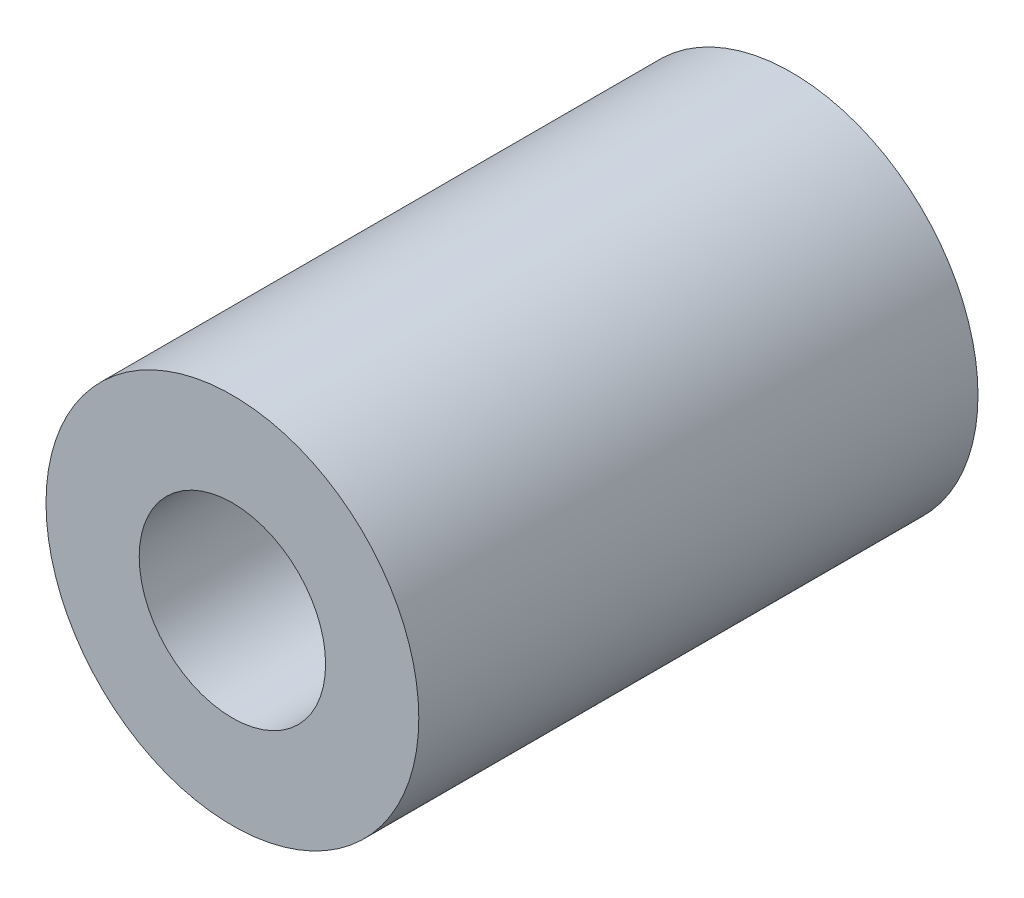
ISO-10303-21;
HEADER;
FILE_DESCRIPTION(('STEP AP214'),'2;1');
FILE_NAME('part.step','',(''),(''),'','','');
FILE_SCHEMA(('AUTOMOTIVE_DESIGN { 1 0 10303 214 1 1 1 1 }'));
ENDSEC;
DATA;
#1=APPLICATION_CONTEXT('core data for automotive mechanical design processes');
#2=APPLICATION_PROTOCOL_DEFINITION('international standard','automotive_design',2000,#1);
#3=PRODUCT_CONTEXT('',#1,'mechanical');
#4=PRODUCT('Part','Part','',(#3));
#5=PRODUCT_RELATED_PRODUCT_CATEGORY('part','',(#4));
#6=PRODUCT_DEFINITION_FORMATION('','',#4);
#7=PRODUCT_DEFINITION_CONTEXT('part definition',#1,'design');
#8=PRODUCT_DEFINITION('design','',#6,#7);
#9=PRODUCT_DEFINITION_SHAPE('','',#8);
#10=(LENGTH_UNIT() NAMED_UNIT(*) SI_UNIT(.MILLI.,.METRE.));
#11=(NAMED_UNIT(*) PLANE_ANGLE_UNIT() SI_UNIT($,.RADIAN.));
#12=(NAMED_UNIT(*) SI_UNIT($,.STERADIAN.) SOLID_ANGLE_UNIT());
#13=UNCERTAINTY_MEASURE_WITH_UNIT(LENGTH_MEASURE(1.E-05),#10,'distance_accuracy_value','');
#14=(GEOMETRIC_REPRESENTATION_CONTEXT(3) GLOBAL_UNCERTAINTY_ASSIGNED_CONTEXT((#13)) GLOBAL_UNIT_ASSIGNED_CONTEXT((#10,
#11,#12)) REPRESENTATION_CONTEXT('',''));
#15=CARTESIAN_POINT('',(0.,0.,0.));
#16=DIRECTION('',(0.,0.,1.));
#17=DIRECTION('',(1.,0.,0.));
#18=AXIS2_PLACEMENT_3D('',#15,#16,#17);
#19=CARTESIAN_POINT('',(0.,0.,30.));
#20=DIRECTION('',(0.,0.,-1.));
#21=DIRECTION('',(-1.,0.,0.));
#22=AXIS2_PLACEMENT_3D('',#19,#20,#21);
#23=CYLINDRICAL_SURFACE('',#22,10.);
#24=CARTESIAN_POINT('',(0.,0.,30.));
#25=DIRECTION('',(0.,0.,1.));
#26=DIRECTION('',(1.,0.,0.));
#27=AXIS2_PLACEMENT_3D('',#24,#25,#26);
#28=CIRCLE('',#27,10.);
#29=CARTESIAN_POINT('',(10.,0.,30.));
#30=VERTEX_POINT('',#29);
#31=EDGE_CURVE('E10',#30,#30,#28,.T.);
#32=ORIENTED_EDGE('',*,*,#31,.F.);
#33=EDGE_LOOP('',(#32));
#34=FACE_BOUND('',#33,.T.);
#35=CARTESIAN_POINT('',(0.,0.,0.));
#36=DIRECTION('',(0.,0.,1.));
#37=DIRECTION('',(1.,0.,0.));
#38=AXIS2_PLACEMENT_3D('',#35,#36,#37);
#39=CIRCLE('',#38,10.);
#40=CARTESIAN_POINT('',(10.,0.,0.));
#41=VERTEX_POINT('',#40);
#42=EDGE_CURVE('E33',#41,#41,#39,.T.);
#43=ORIENTED_EDGE('',*,*,#42,.T.);
#44=EDGE_LOOP('',(#43));
#45=FACE_BOUND('',#44,.T.);
#46=ADVANCED_FACE('F30',(#34,#45),#23,.T.);
#47=CARTESIAN_POINT('',(0.,0.,30.));
#48=DIRECTION('',(0.,0.,1.));
#49=DIRECTION('',(1.,0.,0.));
#50=AXIS2_PLACEMENT_3D('',#47,#48,#49);
#51=PLANE('',#50);
#52=CARTESIAN_POINT('',(0.,0.,30.));
#53=DIRECTION('',(0.,0.,1.));
#54=DIRECTION('',(1.,0.,0.));
#55=AXIS2_PLACEMENT_3D('',#52,#53,#54);
#56=CIRCLE('',#55,5.);
#57=CARTESIAN_POINT('',(5.,0.,30.));
#58=VERTEX_POINT('',#57);
#59=EDGE_CURVE('E40',#58,#58,#56,.T.);
#60=ORIENTED_EDGE('',*,*,#59,.F.);
#61=EDGE_LOOP('',(#60));
#62=FACE_BOUND('',#61,.T.);
#63=ORIENTED_EDGE('',*,*,#31,.T.);
#64=EDGE_LOOP('',(#63));
#65=FACE_BOUND('',#64,.T.);
#66=ADVANCED_FACE('F53',(#62,#65),#51,.T.);
#67=CARTESIAN_POINT('',(0.,0.,0.));
#68=DIRECTION('',(0.,0.,1.));
#69=DIRECTION('',(1.,0.,0.));
#70=AXIS2_PLACEMENT_3D('',#67,#68,#69);
#71=PLANE('',#70);
#72=CARTESIAN_POINT('',(0.,0.,0.));
#73=DIRECTION('',(0.,0.,-1.));
#74=DIRECTION('',(-1.,0.,0.));
#75=AXIS2_PLACEMENT_3D('',#72,#73,#74);
#76=CIRCLE('',#75,5.);
#77=CARTESIAN_POINT('',(-5.,0.,0.));
#78=VERTEX_POINT('',#77);
#79=EDGE_CURVE('E44',#78,#78,#76,.T.);
#80=ORIENTED_EDGE('',*,*,#79,.F.);
#81=EDGE_LOOP('',(#80));
#82=FACE_BOUND('',#81,.T.);
#83=ORIENTED_EDGE('',*,*,#42,.F.);
#84=EDGE_LOOP('',(#83));
#85=FACE_BOUND('',#84,.T.);
#86=ADVANCED_FACE('F50',(#82,#85),#71,.F.);
#87=CARTESIAN_POINT('',(0.,0.,50.));
#88=DIRECTION('',(0.,0.,-1.));
#89=DIRECTION('',(-1.,0.,0.));
#90=AXIS2_PLACEMENT_3D('',#87,#88,#89);
#91=CYLINDRICAL_SURFACE('',#90,5.);
#92=ORIENTED_EDGE('',*,*,#59,.T.);
#93=EDGE_LOOP('',(#92));
#94=FACE_BOUND('',#93,.T.);
#95=ORIENTED_EDGE('',*,*,#79,.T.);
#96=EDGE_LOOP('',(#95));
#97=FACE_BOUND('',#96,.T.);
#98=ADVANCED_FACE('F48',(#94,#97),#91,.F.);
#99=CLOSED_SHELL('',(#46,#66,#86,#98));
#100=MANIFOLD_SOLID_BREP('B2',#99);
#101=ADVANCED_BREP_SHAPE_REPRESENTATION('',(#18,#100),#14);
#102=SHAPE_DEFINITION_REPRESENTATION(#9,#101);
ENDSEC;
END-ISO-10303-21;
